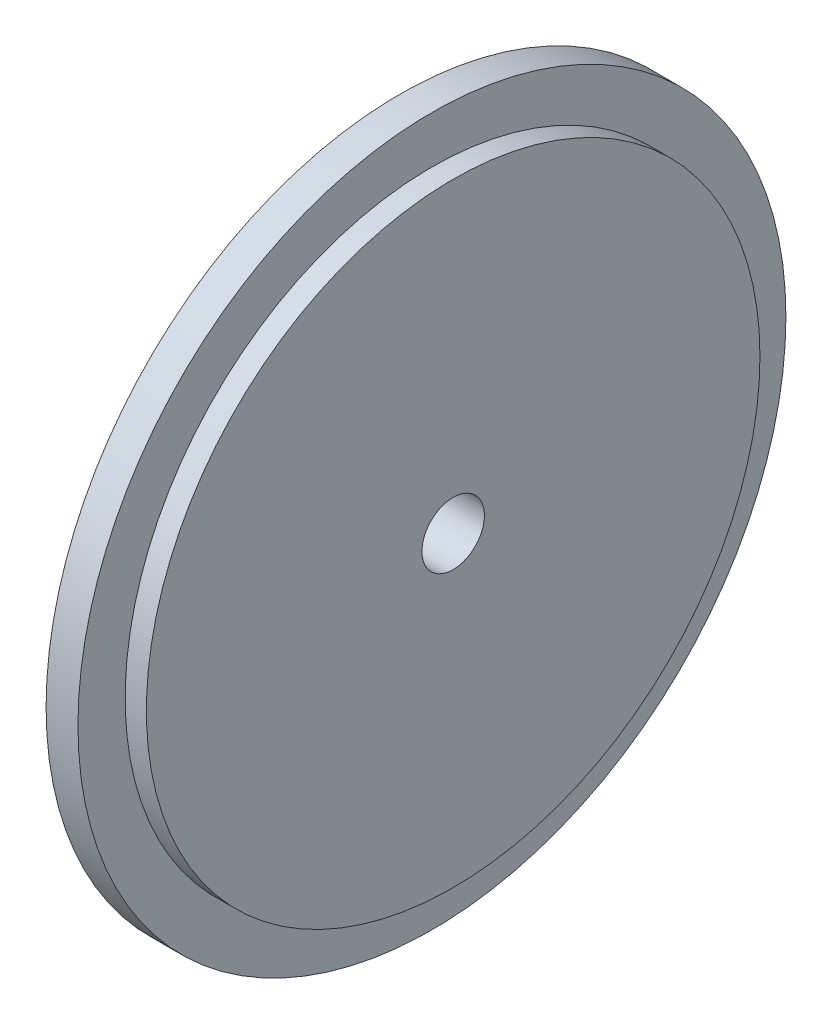
ISO-10303-21;
HEADER;
FILE_DESCRIPTION(('STEP AP214'),'2;1');
FILE_NAME('part.step','',(''),(''),'','','');
FILE_SCHEMA(('AUTOMOTIVE_DESIGN { 1 0 10303 214 1 1 1 1 }'));
ENDSEC;
DATA;
#1=APPLICATION_CONTEXT('core data for automotive mechanical design processes');
#2=APPLICATION_PROTOCOL_DEFINITION('international standard','automotive_design',2000,#1);
#3=PRODUCT_CONTEXT('',#1,'mechanical');
#4=PRODUCT('Part','Part','',(#3));
#5=PRODUCT_RELATED_PRODUCT_CATEGORY('part','',(#4));
#6=PRODUCT_DEFINITION_FORMATION('','',#4);
#7=PRODUCT_DEFINITION_CONTEXT('part definition',#1,'design');
#8=PRODUCT_DEFINITION('design','',#6,#7);
#9=PRODUCT_DEFINITION_SHAPE('','',#8);
#10=(LENGTH_UNIT() NAMED_UNIT(*) SI_UNIT(.MILLI.,.METRE.));
#11=(NAMED_UNIT(*) PLANE_ANGLE_UNIT() SI_UNIT($,.RADIAN.));
#12=(NAMED_UNIT(*) SI_UNIT($,.STERADIAN.) SOLID_ANGLE_UNIT());
#13=UNCERTAINTY_MEASURE_WITH_UNIT(LENGTH_MEASURE(1.E-05),#10,'distance_accuracy_value','');
#14=(GEOMETRIC_REPRESENTATION_CONTEXT(3) GLOBAL_UNCERTAINTY_ASSIGNED_CONTEXT((#13)) GLOBAL_UNIT_ASSIGNED_CONTEXT((#10,
#11,#12)) REPRESENTATION_CONTEXT('',''));
#15=CARTESIAN_POINT('',(0.,0.,0.));
#16=DIRECTION('',(0.,0.,1.));
#17=DIRECTION('',(1.,0.,0.));
#18=AXIS2_PLACEMENT_3D('',#15,#16,#17);
#19=CARTESIAN_POINT('',(4.5,0.,0.));
#20=DIRECTION('',(1.,0.,0.));
#21=DIRECTION('',(0.,0.,-1.));
#22=AXIS2_PLACEMENT_3D('',#19,#20,#21);
#23=PLANE('',#22);
#24=CARTESIAN_POINT('',(4.5,0.,0.));
#25=DIRECTION('',(1.,0.,0.));
#26=DIRECTION('',(0.,0.,-1.));
#27=AXIS2_PLACEMENT_3D('',#24,#25,#26);
#28=CIRCLE('',#27,2.65);
#29=CARTESIAN_POINT('',(4.5,0.,-2.65));
#30=VERTEX_POINT('',#29);
#31=EDGE_CURVE('E41',#30,#30,#28,.T.);
#32=ORIENTED_EDGE('',*,*,#31,.F.);
#33=EDGE_LOOP('',(#32));
#34=FACE_BOUND('',#33,.T.);
#35=CARTESIAN_POINT('',(4.5,0.,0.));
#36=DIRECTION('',(1.,0.,0.));
#37=DIRECTION('',(0.,0.,-1.));
#38=AXIS2_PLACEMENT_3D('',#35,#36,#37);
#39=CIRCLE('',#38,26.);
#40=CARTESIAN_POINT('',(4.5,0.,-26.));
#41=VERTEX_POINT('',#40);
#42=EDGE_CURVE('E50',#41,#41,#39,.T.);
#43=ORIENTED_EDGE('',*,*,#42,.T.);
#44=EDGE_LOOP('',(#43));
#45=FACE_BOUND('',#44,.T.);
#46=ADVANCED_FACE('F33',(#34,#45),#23,.T.);
#47=CARTESIAN_POINT('',(4.5,0.,0.));
#48=DIRECTION('',(-1.,0.,0.));
#49=DIRECTION('',(0.,0.,1.));
#50=AXIS2_PLACEMENT_3D('',#47,#48,#49);
#51=CYLINDRICAL_SURFACE('',#50,30.);
#52=CARTESIAN_POINT('',(0.,0.,0.));
#53=DIRECTION('',(1.,0.,0.));
#54=DIRECTION('',(0.,0.,-1.));
#55=AXIS2_PLACEMENT_3D('',#52,#53,#54);
#56=CIRCLE('',#55,30.);
#57=CARTESIAN_POINT('',(0.,0.,-30.));
#58=VERTEX_POINT('',#57);
#59=EDGE_CURVE('E10',#58,#58,#56,.T.);
#60=ORIENTED_EDGE('',*,*,#59,.T.);
#61=EDGE_LOOP('',(#60));
#62=FACE_BOUND('',#61,.T.);
#63=CARTESIAN_POINT('',(2.7,0.,0.));
#64=DIRECTION('',(1.,0.,0.));
#65=DIRECTION('',(0.,0.,-1.));
#66=AXIS2_PLACEMENT_3D('',#63,#64,#65);
#67=CIRCLE('',#66,30.);
#68=CARTESIAN_POINT('',(2.7,0.,-30.));
#69=VERTEX_POINT('',#68);
#70=EDGE_CURVE('E37',#69,#69,#67,.T.);
#71=ORIENTED_EDGE('',*,*,#70,.F.);
#72=EDGE_LOOP('',(#71));
#73=FACE_BOUND('',#72,.T.);
#74=ADVANCED_FACE('F35',(#62,#73),#51,.T.);
#75=CARTESIAN_POINT('',(0.,0.,0.));
#76=DIRECTION('',(1.,0.,0.));
#77=DIRECTION('',(0.,0.,-1.));
#78=AXIS2_PLACEMENT_3D('',#75,#76,#77);
#79=PLANE('',#78);
#80=ORIENTED_EDGE('',*,*,#59,.F.);
#81=EDGE_LOOP('',(#80));
#82=FACE_BOUND('',#81,.T.);
#83=CARTESIAN_POINT('',(0.,0.,0.));
#84=DIRECTION('',(1.,0.,0.));
#85=DIRECTION('',(0.,0.,-1.));
#86=AXIS2_PLACEMENT_3D('',#83,#84,#85);
#87=CIRCLE('',#86,2.65);
#88=CARTESIAN_POINT('',(0.,0.,-2.65));
#89=VERTEX_POINT('',#88);
#90=EDGE_CURVE('E45',#89,#89,#87,.T.);
#91=ORIENTED_EDGE('',*,*,#90,.T.);
#92=EDGE_LOOP('',(#91));
#93=FACE_BOUND('',#92,.T.);
#94=ADVANCED_FACE('F63',(#82,#93),#79,.F.);
#95=CARTESIAN_POINT('',(4.5,0.,0.));
#96=DIRECTION('',(-1.,0.,0.));
#97=DIRECTION('',(0.,0.,1.));
#98=AXIS2_PLACEMENT_3D('',#95,#96,#97);
#99=CYLINDRICAL_SURFACE('',#98,2.65);
#100=ORIENTED_EDGE('',*,*,#31,.T.);
#101=EDGE_LOOP('',(#100));
#102=FACE_BOUND('',#101,.T.);
#103=ORIENTED_EDGE('',*,*,#90,.F.);
#104=EDGE_LOOP('',(#103));
#105=FACE_BOUND('',#104,.T.);
#106=ADVANCED_FACE('F68',(#102,#105),#99,.F.);
#107=CARTESIAN_POINT('',(2.7,0.,0.));
#108=DIRECTION('',(1.,0.,0.));
#109=DIRECTION('',(0.,0.,-1.));
#110=AXIS2_PLACEMENT_3D('',#107,#108,#109);
#111=PLANE('',#110);
#112=CARTESIAN_POINT('',(2.7,0.,0.));
#113=DIRECTION('',(1.,0.,0.));
#114=DIRECTION('',(0.,0.,-1.));
#115=AXIS2_PLACEMENT_3D('',#112,#113,#114);
#116=CIRCLE('',#115,26.);
#117=CARTESIAN_POINT('',(2.7,0.,-26.));
#118=VERTEX_POINT('',#117);
#119=EDGE_CURVE('E53',#118,#118,#116,.T.);
#120=ORIENTED_EDGE('',*,*,#119,.F.);
#121=EDGE_LOOP('',(#120));
#122=FACE_BOUND('',#121,.T.);
#123=ORIENTED_EDGE('',*,*,#70,.T.);
#124=EDGE_LOOP('',(#123));
#125=FACE_BOUND('',#124,.T.);
#126=ADVANCED_FACE('F60',(#122,#125),#111,.T.);
#127=CARTESIAN_POINT('',(2.7,0.,0.));
#128=DIRECTION('',(1.,0.,0.));
#129=DIRECTION('',(0.,0.,-1.));
#130=AXIS2_PLACEMENT_3D('',#127,#128,#129);
#131=CYLINDRICAL_SURFACE('',#130,26.);
#132=ORIENTED_EDGE('',*,*,#119,.T.);
#133=EDGE_LOOP('',(#132));
#134=FACE_BOUND('',#133,.T.);
#135=ORIENTED_EDGE('',*,*,#42,.F.);
#136=EDGE_LOOP('',(#135));
#137=FACE_BOUND('',#136,.T.);
#138=ADVANCED_FACE('F82',(#134,#137),#131,.T.);
#139=CLOSED_SHELL('',(#46,#74,#94,#106,#126,#138));
#140=MANIFOLD_SOLID_BREP('B2',#139);
#141=ADVANCED_BREP_SHAPE_REPRESENTATION('',(#18,#140),#14);
#142=SHAPE_DEFINITION_REPRESENTATION(#9,#141);
ENDSEC;
END-ISO-10303-21;
